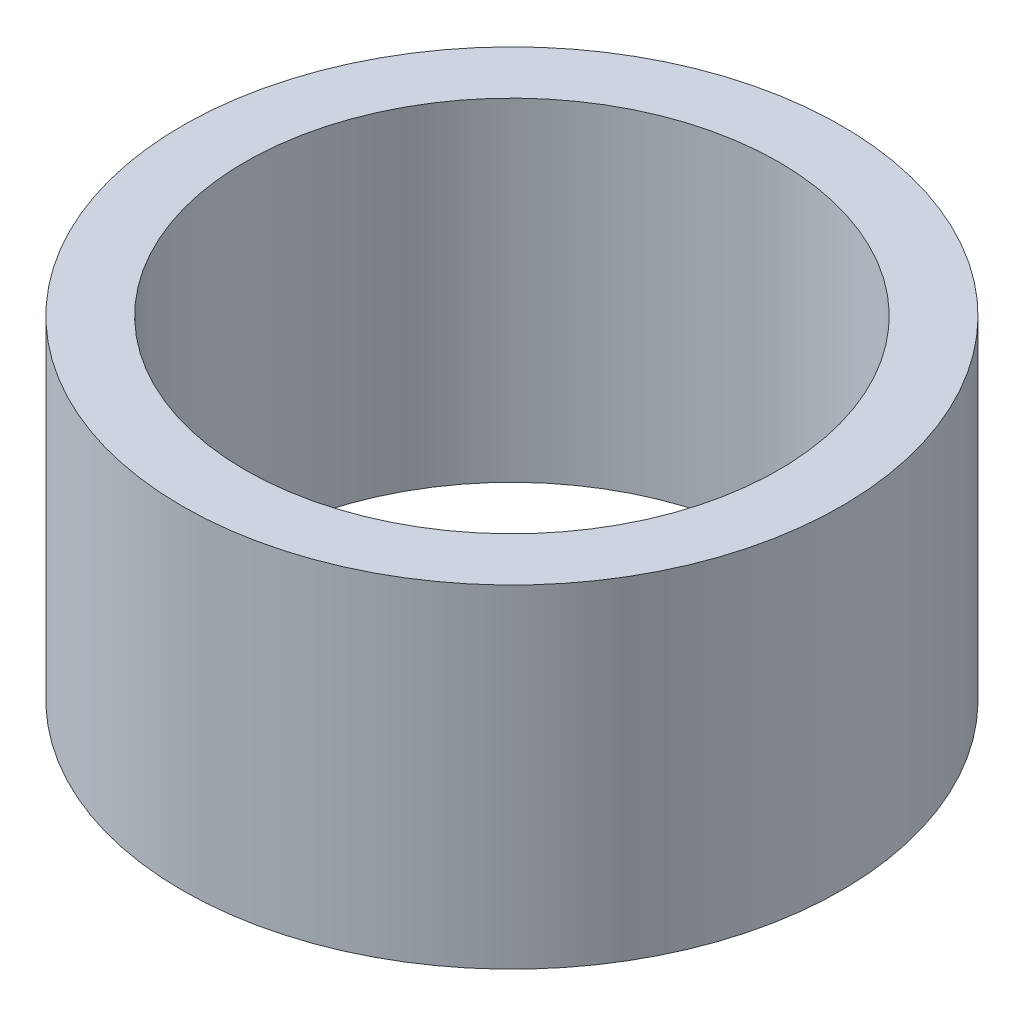
ISO-10303-21;
HEADER;
FILE_DESCRIPTION(('STEP AP214'),'2;1');
FILE_NAME('part.step','',(''),(''),'','','');
FILE_SCHEMA(('AUTOMOTIVE_DESIGN { 1 0 10303 214 1 1 1 1 }'));
ENDSEC;
DATA;
#1=APPLICATION_CONTEXT('core data for automotive mechanical design processes');
#2=APPLICATION_PROTOCOL_DEFINITION('international standard','automotive_design',2000,#1);
#3=PRODUCT_CONTEXT('',#1,'mechanical');
#4=PRODUCT('Part','Part','',(#3));
#5=PRODUCT_RELATED_PRODUCT_CATEGORY('part','',(#4));
#6=PRODUCT_DEFINITION_FORMATION('','',#4);
#7=PRODUCT_DEFINITION_CONTEXT('part definition',#1,'design');
#8=PRODUCT_DEFINITION('design','',#6,#7);
#9=PRODUCT_DEFINITION_SHAPE('','',#8);
#10=(LENGTH_UNIT() NAMED_UNIT(*) SI_UNIT(.MILLI.,.METRE.));
#11=(NAMED_UNIT(*) PLANE_ANGLE_UNIT() SI_UNIT($,.RADIAN.));
#12=(NAMED_UNIT(*) SI_UNIT($,.STERADIAN.) SOLID_ANGLE_UNIT());
#13=UNCERTAINTY_MEASURE_WITH_UNIT(LENGTH_MEASURE(1.E-05),#10,'distance_accuracy_value','');
#14=(GEOMETRIC_REPRESENTATION_CONTEXT(3) GLOBAL_UNCERTAINTY_ASSIGNED_CONTEXT((#13)) GLOBAL_UNIT_ASSIGNED_CONTEXT((#10,
#11,#12)) REPRESENTATION_CONTEXT('',''));
#15=CARTESIAN_POINT('',(0.,0.,0.));
#16=DIRECTION('',(0.,0.,1.));
#17=DIRECTION('',(1.,0.,0.));
#18=AXIS2_PLACEMENT_3D('',#15,#16,#17);
#19=CARTESIAN_POINT('',(0.,5.3,0.));
#20=DIRECTION('',(0.,1.,0.));
#21=DIRECTION('',(0.,0.,1.));
#22=AXIS2_PLACEMENT_3D('',#19,#20,#21);
#23=PLANE('',#22);
#24=CARTESIAN_POINT('',(0.,5.3,0.));
#25=DIRECTION('',(0.,1.,0.));
#26=DIRECTION('',(0.,0.,1.));
#27=AXIS2_PLACEMENT_3D('',#24,#25,#26);
#28=CIRCLE('',#27,5.25);
#29=CARTESIAN_POINT('',(0.,5.3,5.25));
#30=VERTEX_POINT('',#29);
#31=EDGE_CURVE('E10',#30,#30,#28,.T.);
#32=ORIENTED_EDGE('',*,*,#31,.T.);
#33=EDGE_LOOP('',(#32));
#34=FACE_BOUND('',#33,.T.);
#35=CARTESIAN_POINT('',(0.,5.3,0.));
#36=DIRECTION('',(0.,1.,0.));
#37=DIRECTION('',(0.,0.,1.));
#38=AXIS2_PLACEMENT_3D('',#35,#36,#37);
#39=CIRCLE('',#38,4.25);
#40=CARTESIAN_POINT('',(0.,5.3,4.25));
#41=VERTEX_POINT('',#40);
#42=EDGE_CURVE('E50',#41,#41,#39,.T.);
#43=ORIENTED_EDGE('',*,*,#42,.F.);
#44=EDGE_LOOP('',(#43));
#45=FACE_BOUND('',#44,.T.);
#46=ADVANCED_FACE('F39',(#34,#45),#23,.T.);
#47=CARTESIAN_POINT('',(0.,0.,0.));
#48=DIRECTION('',(0.,1.,0.));
#49=DIRECTION('',(0.,0.,1.));
#50=AXIS2_PLACEMENT_3D('',#47,#48,#49);
#51=PLANE('',#50);
#52=CARTESIAN_POINT('',(0.,0.,0.));
#53=DIRECTION('',(0.,1.,0.));
#54=DIRECTION('',(0.,0.,1.));
#55=AXIS2_PLACEMENT_3D('',#52,#53,#54);
#56=CIRCLE('',#55,5.25);
#57=CARTESIAN_POINT('',(0.,0.,5.25));
#58=VERTEX_POINT('',#57);
#59=EDGE_CURVE('E43',#58,#58,#56,.T.);
#60=ORIENTED_EDGE('',*,*,#59,.F.);
#61=EDGE_LOOP('',(#60));
#62=FACE_BOUND('',#61,.T.);
#63=CARTESIAN_POINT('',(0.,0.,0.));
#64=DIRECTION('',(0.,1.,0.));
#65=DIRECTION('',(0.,0.,1.));
#66=AXIS2_PLACEMENT_3D('',#63,#64,#65);
#67=CIRCLE('',#66,4.25);
#68=CARTESIAN_POINT('',(0.,0.,4.25));
#69=VERTEX_POINT('',#68);
#70=EDGE_CURVE('E52',#69,#69,#67,.T.);
#71=ORIENTED_EDGE('',*,*,#70,.T.);
#72=EDGE_LOOP('',(#71));
#73=FACE_BOUND('',#72,.T.);
#74=ADVANCED_FACE('F62',(#62,#73),#51,.F.);
#75=CARTESIAN_POINT('',(0.,5.3,0.));
#76=DIRECTION('',(0.,-1.,0.));
#77=DIRECTION('',(0.,0.,-1.));
#78=AXIS2_PLACEMENT_3D('',#75,#76,#77);
#79=CYLINDRICAL_SURFACE('',#78,5.25);
#80=ORIENTED_EDGE('',*,*,#31,.F.);
#81=EDGE_LOOP('',(#80));
#82=FACE_BOUND('',#81,.T.);
#83=ORIENTED_EDGE('',*,*,#59,.T.);
#84=EDGE_LOOP('',(#83));
#85=FACE_BOUND('',#84,.T.);
#86=ADVANCED_FACE('F41',(#82,#85),#79,.T.);
#87=CARTESIAN_POINT('',(0.,5.3,0.));
#88=DIRECTION('',(0.,-1.,0.));
#89=DIRECTION('',(0.,0.,-1.));
#90=AXIS2_PLACEMENT_3D('',#87,#88,#89);
#91=CYLINDRICAL_SURFACE('',#90,4.25);
#92=ORIENTED_EDGE('',*,*,#42,.T.);
#93=EDGE_LOOP('',(#92));
#94=FACE_BOUND('',#93,.T.);
#95=ORIENTED_EDGE('',*,*,#70,.F.);
#96=EDGE_LOOP('',(#95));
#97=FACE_BOUND('',#96,.T.);
#98=ADVANCED_FACE('F58',(#94,#97),#91,.F.);
#99=CLOSED_SHELL('',(#46,#74,#86,#98));
#100=MANIFOLD_SOLID_BREP('B2',#99);
#101=ADVANCED_BREP_SHAPE_REPRESENTATION('',(#18,#100),#14);
#102=SHAPE_DEFINITION_REPRESENTATION(#9,#101);
ENDSEC;
END-ISO-10303-21;
